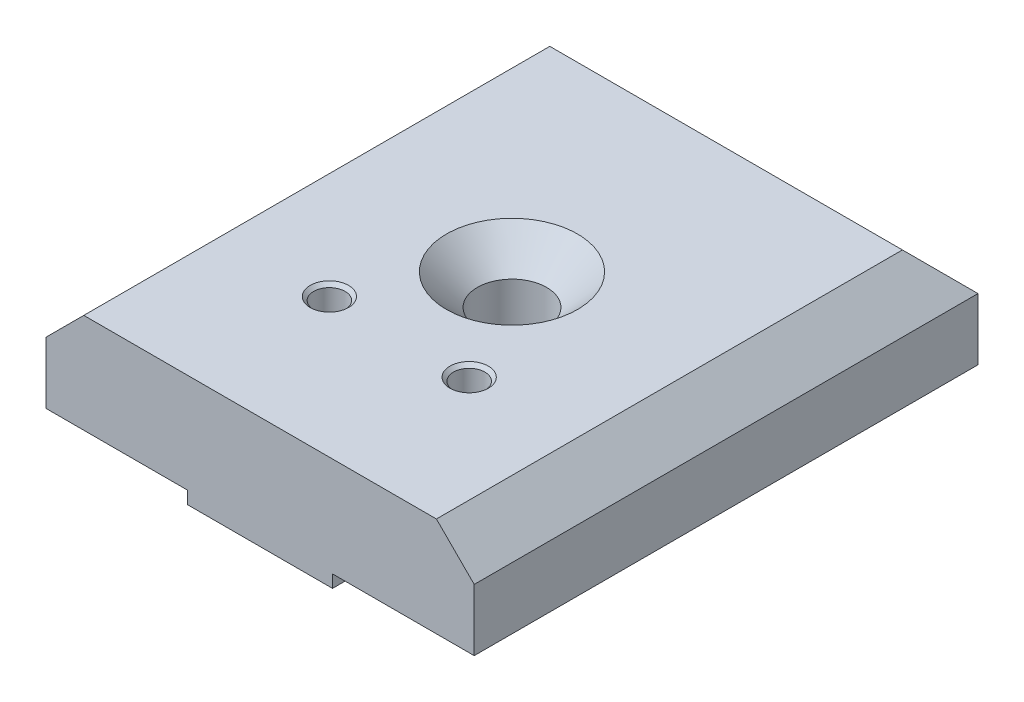
ISO-10303-21;
HEADER;
FILE_DESCRIPTION(('STEP AP214'),'2;1');
FILE_NAME('part.step','',(''),(''),'','','');
FILE_SCHEMA(('AUTOMOTIVE_DESIGN { 1 0 10303 214 1 1 1 1 }'));
ENDSEC;
DATA;
#1=APPLICATION_CONTEXT('core data for automotive mechanical design processes');
#2=APPLICATION_PROTOCOL_DEFINITION('international standard','automotive_design',2000,#1);
#3=PRODUCT_CONTEXT('',#1,'mechanical');
#4=PRODUCT('Part','Part','',(#3));
#5=PRODUCT_RELATED_PRODUCT_CATEGORY('part','',(#4));
#6=PRODUCT_DEFINITION_FORMATION('','',#4);
#7=PRODUCT_DEFINITION_CONTEXT('part definition',#1,'design');
#8=PRODUCT_DEFINITION('design','',#6,#7);
#9=PRODUCT_DEFINITION_SHAPE('','',#8);
#10=(LENGTH_UNIT() NAMED_UNIT(*) SI_UNIT(.MILLI.,.METRE.));
#11=(NAMED_UNIT(*) PLANE_ANGLE_UNIT() SI_UNIT($,.RADIAN.));
#12=(NAMED_UNIT(*) SI_UNIT($,.STERADIAN.) SOLID_ANGLE_UNIT());
#13=UNCERTAINTY_MEASURE_WITH_UNIT(LENGTH_MEASURE(1.E-05),#10,'distance_accuracy_value','');
#14=(GEOMETRIC_REPRESENTATION_CONTEXT(3) GLOBAL_UNCERTAINTY_ASSIGNED_CONTEXT((#13)) GLOBAL_UNIT_ASSIGNED_CONTEXT((#10,
#11,#12)) REPRESENTATION_CONTEXT('',''));
#15=CARTESIAN_POINT('',(0.,0.,0.));
#16=DIRECTION('',(0.,0.,1.));
#17=DIRECTION('',(1.,0.,0.));
#18=AXIS2_PLACEMENT_3D('',#15,#16,#17);
#19=CARTESIAN_POINT('',(0.,0.,0.));
#20=DIRECTION('',(0.,1.,0.));
#21=DIRECTION('',(0.,0.,1.));
#22=AXIS2_PLACEMENT_3D('',#19,#20,#21);
#23=PLANE('',#22);
#24=DIRECTION('',(0.,0.,1.));
#25=VECTOR('',#24,1.);
#26=CARTESIAN_POINT('',(5.75,0.,20.));
#27=LINE('',#26,#25);
#28=CARTESIAN_POINT('',(5.75,0.,-20.));
#29=VERTEX_POINT('',#28);
#30=CARTESIAN_POINT('',(5.75,0.,7.71610373207478));
#31=VERTEX_POINT('',#30);
#32=EDGE_CURVE('E47',#29,#31,#27,.T.);
#33=ORIENTED_EDGE('',*,*,#32,.F.);
#34=DIRECTION('',(-1.,0.,0.));
#35=VECTOR('',#34,1.);
#36=CARTESIAN_POINT('',(-17.,0.,-20.));
#37=LINE('',#36,#35);
#38=CARTESIAN_POINT('',(17.,0.,-20.));
#39=VERTEX_POINT('',#38);
#40=EDGE_CURVE('E196',#39,#29,#37,.T.);
#41=ORIENTED_EDGE('',*,*,#40,.F.);
#42=DIRECTION('',(0.,0.,-1.));
#43=VECTOR('',#42,1.);
#44=CARTESIAN_POINT('',(17.,0.,-20.));
#45=LINE('',#44,#43);
#46=CARTESIAN_POINT('',(17.,0.,20.));
#47=VERTEX_POINT('',#46);
#48=EDGE_CURVE('E187',#47,#39,#45,.T.);
#49=ORIENTED_EDGE('',*,*,#48,.F.);
#50=DIRECTION('',(1.,0.,0.));
#51=VECTOR('',#50,1.);
#52=CARTESIAN_POINT('',(-17.,0.,20.));
#53=LINE('',#52,#51);
#54=CARTESIAN_POINT('',(5.75,0.,20.));
#55=VERTEX_POINT('',#54);
#56=EDGE_CURVE('E61',#55,#47,#53,.T.);
#57=ORIENTED_EDGE('',*,*,#56,.F.);
#58=CARTESIAN_POINT('',(5.75,0.,10.1838962679252));
#59=VERTEX_POINT('',#58);
#60=EDGE_CURVE('E11',#59,#55,#27,.T.);
#61=ORIENTED_EDGE('',*,*,#60,.F.);
#62=CARTESIAN_POINT('',(5.54999999999931,0.,8.94999999999997));
#63=DIRECTION('',(0.,1.,0.));
#64=DIRECTION('',(0.,0.,1.));
#65=AXIS2_PLACEMENT_3D('',#62,#63,#64);
#66=CIRCLE('',#65,1.25);
#67=EDGE_CURVE('E176',#59,#31,#66,.T.);
#68=ORIENTED_EDGE('',*,*,#67,.T.);
#69=EDGE_LOOP('',(#33,#41,#49,#57,#61,#68));
#70=FACE_BOUND('',#69,.T.);
#71=ADVANCED_FACE('F36',(#70),#23,.F.);
#72=DIRECTION('',(0.,0.,-1.));
#73=VECTOR('',#72,1.);
#74=CARTESIAN_POINT('',(-5.75,0.,20.));
#75=LINE('',#74,#73);
#76=CARTESIAN_POINT('',(-5.75,0.,20.));
#77=VERTEX_POINT('',#76);
#78=CARTESIAN_POINT('',(-5.75,0.,10.1838962679252));
#79=VERTEX_POINT('',#78);
#80=EDGE_CURVE('E149',#77,#79,#75,.T.);
#81=ORIENTED_EDGE('',*,*,#80,.F.);
#82=CARTESIAN_POINT('',(-17.,0.,20.));
#83=VERTEX_POINT('',#82);
#84=EDGE_CURVE('E192',#83,#77,#53,.T.);
#85=ORIENTED_EDGE('',*,*,#84,.F.);
#86=DIRECTION('',(0.,0.,1.));
#87=VECTOR('',#86,1.);
#88=CARTESIAN_POINT('',(-17.,0.,-20.));
#89=LINE('',#88,#87);
#90=CARTESIAN_POINT('',(-17.,0.,-20.));
#91=VERTEX_POINT('',#90);
#92=EDGE_CURVE('E198',#91,#83,#89,.T.);
#93=ORIENTED_EDGE('',*,*,#92,.F.);
#94=CARTESIAN_POINT('',(-5.75,0.,-20.));
#95=VERTEX_POINT('',#94);
#96=EDGE_CURVE('E195',#95,#91,#37,.T.);
#97=ORIENTED_EDGE('',*,*,#96,.F.);
#98=CARTESIAN_POINT('',(-5.75,0.,7.71610373207478));
#99=VERTEX_POINT('',#98);
#100=EDGE_CURVE('E45',#99,#95,#75,.T.);
#101=ORIENTED_EDGE('',*,*,#100,.F.);
#102=CARTESIAN_POINT('',(-5.54999999999931,0.,8.94999999999997));
#103=DIRECTION('',(0.,1.,0.));
#104=DIRECTION('',(0.,0.,1.));
#105=AXIS2_PLACEMENT_3D('',#102,#103,#104);
#106=CIRCLE('',#105,1.25);
#107=EDGE_CURVE('E166',#99,#79,#106,.T.);
#108=ORIENTED_EDGE('',*,*,#107,.T.);
#109=EDGE_LOOP('',(#81,#85,#93,#97,#101,#108));
#110=FACE_BOUND('',#109,.T.);
#111=ADVANCED_FACE('F272',(#110),#23,.F.);
#112=CARTESIAN_POINT('',(17.,7.9,-20.));
#113=DIRECTION('',(-1.,0.,0.));
#114=DIRECTION('',(0.,0.,1.));
#115=AXIS2_PLACEMENT_3D('',#112,#113,#114);
#116=PLANE('',#115);
#117=DIRECTION('',(0.,-1.,0.));
#118=VECTOR('',#117,1.);
#119=CARTESIAN_POINT('',(17.,7.9,-20.));
#120=LINE('',#119,#118);
#121=CARTESIAN_POINT('',(17.,4.9,-20.));
#122=VERTEX_POINT('',#121);
#123=EDGE_CURVE('E209',#122,#39,#120,.T.);
#124=ORIENTED_EDGE('',*,*,#123,.F.);
#125=DIRECTION('',(0.,0.,1.));
#126=VECTOR('',#125,1.);
#127=CARTESIAN_POINT('',(17.,4.9,20.));
#128=LINE('',#127,#126);
#129=CARTESIAN_POINT('',(17.,4.9,20.));
#130=VERTEX_POINT('',#129);
#131=EDGE_CURVE('E218',#122,#130,#128,.T.);
#132=ORIENTED_EDGE('',*,*,#131,.T.);
#133=DIRECTION('',(0.,-1.,0.));
#134=VECTOR('',#133,1.);
#135=CARTESIAN_POINT('',(17.,7.9,20.));
#136=LINE('',#135,#134);
#137=EDGE_CURVE('E191',#130,#47,#136,.T.);
#138=ORIENTED_EDGE('',*,*,#137,.T.);
#139=ORIENTED_EDGE('',*,*,#48,.T.);
#140=EDGE_LOOP('',(#124,#132,#138,#139));
#141=FACE_BOUND('',#140,.T.);
#142=ADVANCED_FACE('F249',(#141),#116,.F.);
#143=CARTESIAN_POINT('',(-17.,7.9,-20.));
#144=DIRECTION('',(0.,0.,1.));
#145=DIRECTION('',(1.,0.,0.));
#146=AXIS2_PLACEMENT_3D('',#143,#144,#145);
#147=PLANE('',#146);
#148=DIRECTION('',(0.,-1.,0.));
#149=VECTOR('',#148,1.);
#150=CARTESIAN_POINT('',(-17.,7.9,-20.));
#151=LINE('',#150,#149);
#152=CARTESIAN_POINT('',(-17.,4.9,-20.));
#153=VERTEX_POINT('',#152);
#154=EDGE_CURVE('E206',#153,#91,#151,.T.);
#155=ORIENTED_EDGE('',*,*,#154,.F.);
#156=DIRECTION('',(1.,0.,0.));
#157=VECTOR('',#156,1.);
#158=CARTESIAN_POINT('',(17.,4.9,-20.));
#159=LINE('',#158,#157);
#160=EDGE_CURVE('E224',#153,#122,#159,.T.);
#161=ORIENTED_EDGE('',*,*,#160,.T.);
#162=ORIENTED_EDGE('',*,*,#123,.T.);
#163=ORIENTED_EDGE('',*,*,#40,.T.);
#164=DIRECTION('',(0.,1.,0.));
#165=VECTOR('',#164,1.);
#166=CARTESIAN_POINT('',(5.75,-1.,-20.));
#167=LINE('',#166,#165);
#168=CARTESIAN_POINT('',(5.75,-1.,-20.));
#169=VERTEX_POINT('',#168);
#170=EDGE_CURVE('E243',#169,#29,#167,.T.);
#171=ORIENTED_EDGE('',*,*,#170,.F.);
#172=DIRECTION('',(1.,0.,0.));
#173=VECTOR('',#172,1.);
#174=CARTESIAN_POINT('',(-5.75,-1.,-20.));
#175=LINE('',#174,#173);
#176=CARTESIAN_POINT('',(-5.75,-1.,-20.));
#177=VERTEX_POINT('',#176);
#178=EDGE_CURVE('E145',#177,#169,#175,.T.);
#179=ORIENTED_EDGE('',*,*,#178,.F.);
#180=DIRECTION('',(0.,1.,0.));
#181=VECTOR('',#180,1.);
#182=CARTESIAN_POINT('',(-5.75,-1.,-20.));
#183=LINE('',#182,#181);
#184=EDGE_CURVE('E155',#177,#95,#183,.T.);
#185=ORIENTED_EDGE('',*,*,#184,.T.);
#186=ORIENTED_EDGE('',*,*,#96,.T.);
#187=EDGE_LOOP('',(#155,#161,#162,#163,#171,#179,#185,#186));
#188=FACE_BOUND('',#187,.T.);
#189=ADVANCED_FACE('F246',(#188),#147,.F.);
#190=CARTESIAN_POINT('',(-17.,7.9,-20.));
#191=DIRECTION('',(1.,0.,0.));
#192=DIRECTION('',(0.,0.,-1.));
#193=AXIS2_PLACEMENT_3D('',#190,#191,#192);
#194=PLANE('',#193);
#195=DIRECTION('',(0.,-1.,0.));
#196=VECTOR('',#195,1.);
#197=CARTESIAN_POINT('',(-17.,7.9,20.));
#198=LINE('',#197,#196);
#199=CARTESIAN_POINT('',(-17.,4.9,20.));
#200=VERTEX_POINT('',#199);
#201=EDGE_CURVE('E204',#200,#83,#198,.T.);
#202=ORIENTED_EDGE('',*,*,#201,.F.);
#203=DIRECTION('',(0.,0.,-1.));
#204=VECTOR('',#203,1.);
#205=CARTESIAN_POINT('',(-17.,4.9,-20.));
#206=LINE('',#205,#204);
#207=EDGE_CURVE('E226',#200,#153,#206,.T.);
#208=ORIENTED_EDGE('',*,*,#207,.T.);
#209=ORIENTED_EDGE('',*,*,#154,.T.);
#210=ORIENTED_EDGE('',*,*,#92,.T.);
#211=EDGE_LOOP('',(#202,#208,#209,#210));
#212=FACE_BOUND('',#211,.T.);
#213=ADVANCED_FACE('F269',(#212),#194,.F.);
#214=CARTESIAN_POINT('',(-17.,7.9,20.));
#215=DIRECTION('',(0.,0.,-1.));
#216=DIRECTION('',(-1.,0.,0.));
#217=AXIS2_PLACEMENT_3D('',#214,#215,#216);
#218=PLANE('',#217);
#219=ORIENTED_EDGE('',*,*,#137,.F.);
#220=DIRECTION('',(-0.707106781186547,0.707106781186548,0.));
#221=VECTOR('',#220,1.);
#222=CARTESIAN_POINT('',(14.,7.9,20.));
#223=LINE('',#222,#221);
#224=CARTESIAN_POINT('',(14.,7.9,20.));
#225=VERTEX_POINT('',#224);
#226=EDGE_CURVE('E222',#130,#225,#223,.T.);
#227=ORIENTED_EDGE('',*,*,#226,.T.);
#228=DIRECTION('',(1.,0.,0.));
#229=VECTOR('',#228,1.);
#230=CARTESIAN_POINT('',(-17.,7.9,20.));
#231=LINE('',#230,#229);
#232=CARTESIAN_POINT('',(-14.,7.9,20.));
#233=VERTEX_POINT('',#232);
#234=EDGE_CURVE('E188',#233,#225,#231,.T.);
#235=ORIENTED_EDGE('',*,*,#234,.F.);
#236=DIRECTION('',(-0.707106781186547,-0.707106781186548,0.));
#237=VECTOR('',#236,1.);
#238=CARTESIAN_POINT('',(-14.,7.9,20.));
#239=LINE('',#238,#237);
#240=EDGE_CURVE('E220',#233,#200,#239,.T.);
#241=ORIENTED_EDGE('',*,*,#240,.T.);
#242=ORIENTED_EDGE('',*,*,#201,.T.);
#243=ORIENTED_EDGE('',*,*,#84,.T.);
#244=DIRECTION('',(0.,1.,0.));
#245=VECTOR('',#244,1.);
#246=CARTESIAN_POINT('',(-5.75,-1.,20.));
#247=LINE('',#246,#245);
#248=CARTESIAN_POINT('',(-5.75,-1.,20.));
#249=VERTEX_POINT('',#248);
#250=EDGE_CURVE('E136',#249,#77,#247,.T.);
#251=ORIENTED_EDGE('',*,*,#250,.F.);
#252=DIRECTION('',(-1.,0.,0.));
#253=VECTOR('',#252,1.);
#254=CARTESIAN_POINT('',(-5.75,-1.,20.));
#255=LINE('',#254,#253);
#256=CARTESIAN_POINT('',(5.75,-1.,20.));
#257=VERTEX_POINT('',#256);
#258=EDGE_CURVE('E128',#257,#249,#255,.T.);
#259=ORIENTED_EDGE('',*,*,#258,.F.);
#260=DIRECTION('',(0.,1.,0.));
#261=VECTOR('',#260,1.);
#262=CARTESIAN_POINT('',(5.75,-1.,20.));
#263=LINE('',#262,#261);
#264=EDGE_CURVE('E133',#257,#55,#263,.T.);
#265=ORIENTED_EDGE('',*,*,#264,.T.);
#266=ORIENTED_EDGE('',*,*,#56,.T.);
#267=EDGE_LOOP('',(#219,#227,#235,#241,#242,#243,#251,#259,#265,#266));
#268=FACE_BOUND('',#267,.T.);
#269=ADVANCED_FACE('F131',(#268),#218,.F.);
#270=CARTESIAN_POINT('',(0.,7.9,0.));
#271=DIRECTION('',(0.,1.,0.));
#272=DIRECTION('',(0.,0.,1.));
#273=AXIS2_PLACEMENT_3D('',#270,#271,#272);
#274=PLANE('',#273);
#275=CARTESIAN_POINT('',(-5.54999999999931,7.9,8.94999999999997));
#276=DIRECTION('',(0.,1.,0.));
#277=DIRECTION('',(0.,0.,1.));
#278=AXIS2_PLACEMENT_3D('',#275,#276,#277);
#279=CIRCLE('',#278,1.525);
#280=CARTESIAN_POINT('',(-5.54999999999931,7.9,10.475));
#281=VERTEX_POINT('',#280);
#282=EDGE_CURVE('E159',#281,#281,#279,.T.);
#283=ORIENTED_EDGE('',*,*,#282,.F.);
#284=EDGE_LOOP('',(#283));
#285=FACE_BOUND('',#284,.T.);
#286=CARTESIAN_POINT('',(5.54999999999931,7.9,8.94999999999997));
#287=DIRECTION('',(0.,1.,0.));
#288=DIRECTION('',(0.,0.,1.));
#289=AXIS2_PLACEMENT_3D('',#286,#287,#288);
#290=CIRCLE('',#289,1.525);
#291=CARTESIAN_POINT('',(5.54999999999931,7.9,10.475));
#292=VERTEX_POINT('',#291);
#293=EDGE_CURVE('E169',#292,#292,#290,.T.);
#294=ORIENTED_EDGE('',*,*,#293,.F.);
#295=EDGE_LOOP('',(#294));
#296=FACE_BOUND('',#295,.T.);
#297=CARTESIAN_POINT('',(0.,7.9,0.));
#298=DIRECTION('',(0.,1.,0.));
#299=DIRECTION('',(0.,0.,1.));
#300=AXIS2_PLACEMENT_3D('',#297,#298,#299);
#301=CIRCLE('',#300,5.2);
#302=CARTESIAN_POINT('',(0.,7.9,5.2));
#303=VERTEX_POINT('',#302);
#304=EDGE_CURVE('E178',#303,#303,#301,.T.);
#305=ORIENTED_EDGE('',*,*,#304,.F.);
#306=EDGE_LOOP('',(#305));
#307=FACE_BOUND('',#306,.T.);
#308=ORIENTED_EDGE('',*,*,#234,.T.);
#309=DIRECTION('',(0.,0.,-1.));
#310=VECTOR('',#309,1.);
#311=CARTESIAN_POINT('',(14.,7.9,-20.));
#312=LINE('',#311,#310);
#313=CARTESIAN_POINT('',(14.,7.9,-17.));
#314=VERTEX_POINT('',#313);
#315=EDGE_CURVE('E215',#225,#314,#312,.T.);
#316=ORIENTED_EDGE('',*,*,#315,.T.);
#317=DIRECTION('',(-1.,0.,0.));
#318=VECTOR('',#317,1.);
#319=CARTESIAN_POINT('',(-17.,7.9,-17.));
#320=LINE('',#319,#318);
#321=CARTESIAN_POINT('',(-14.,7.9,-17.));
#322=VERTEX_POINT('',#321);
#323=EDGE_CURVE('E213',#314,#322,#320,.T.);
#324=ORIENTED_EDGE('',*,*,#323,.T.);
#325=DIRECTION('',(0.,0.,1.));
#326=VECTOR('',#325,1.);
#327=CARTESIAN_POINT('',(-14.,7.9,20.));
#328=LINE('',#327,#326);
#329=EDGE_CURVE('E211',#322,#233,#328,.T.);
#330=ORIENTED_EDGE('',*,*,#329,.T.);
#331=EDGE_LOOP('',(#308,#316,#324,#330));
#332=FACE_BOUND('',#331,.T.);
#333=ADVANCED_FACE('F259',(#285,#296,#307,#332),#274,.T.);
#334=CARTESIAN_POINT('',(0.,7.9,0.));
#335=DIRECTION('',(0.,1.,0.));
#336=DIRECTION('',(0.,0.,1.));
#337=AXIS2_PLACEMENT_3D('',#334,#335,#336);
#338=CYLINDRICAL_SURFACE('',#337,2.74999999999999);
#339=CARTESIAN_POINT('',(0.,0.,0.));
#340=DIRECTION('',(0.,1.,0.));
#341=DIRECTION('',(0.,0.,1.));
#342=AXIS2_PLACEMENT_3D('',#339,#340,#341);
#343=CIRCLE('',#342,2.75);
#344=CARTESIAN_POINT('',(0.,0.,2.75));
#345=VERTEX_POINT('',#344);
#346=EDGE_CURVE('E184',#345,#345,#343,.T.);
#347=ORIENTED_EDGE('',*,*,#346,.F.);
#348=EDGE_LOOP('',(#347));
#349=FACE_BOUND('',#348,.T.);
#350=CARTESIAN_POINT('',(0.,5.44999999999999,0.));
#351=DIRECTION('',(0.,1.,0.));
#352=DIRECTION('',(0.,0.,1.));
#353=AXIS2_PLACEMENT_3D('',#350,#351,#352);
#354=CIRCLE('',#353,2.74999999999999);
#355=CARTESIAN_POINT('',(0.,5.44999999999999,2.74999999999999));
#356=VERTEX_POINT('',#355);
#357=EDGE_CURVE('E181',#356,#356,#354,.T.);
#358=ORIENTED_EDGE('',*,*,#357,.T.);
#359=EDGE_LOOP('',(#358));
#360=FACE_BOUND('',#359,.T.);
#361=ADVANCED_FACE('F293',(#349,#360),#338,.F.);
#362=CARTESIAN_POINT('',(0.,7.9,0.));
#363=DIRECTION('',(0.,1.,0.));
#364=DIRECTION('',(0.,0.,1.));
#365=AXIS2_PLACEMENT_3D('',#362,#363,#364);
#366=CONICAL_SURFACE('',#365,5.2,0.785398163397449);
#367=ORIENTED_EDGE('',*,*,#357,.F.);
#368=EDGE_LOOP('',(#367));
#369=FACE_BOUND('',#368,.T.);
#370=ORIENTED_EDGE('',*,*,#304,.T.);
#371=EDGE_LOOP('',(#370));
#372=FACE_BOUND('',#371,.T.);
#373=ADVANCED_FACE('F299',(#369,#372),#366,.F.);
#374=CARTESIAN_POINT('',(5.54999999999931,7.9,8.94999999999997));
#375=DIRECTION('',(0.,1.,0.));
#376=DIRECTION('',(0.,0.,1.));
#377=AXIS2_PLACEMENT_3D('',#374,#375,#376);
#378=CYLINDRICAL_SURFACE('',#377,1.25);
#379=ORIENTED_EDGE('',*,*,#67,.F.);
#380=EDGE_CURVE('E175',#31,#59,#66,.T.);
#381=ORIENTED_EDGE('',*,*,#380,.F.);
#382=EDGE_LOOP('',(#379,#381));
#383=FACE_BOUND('',#382,.T.);
#384=CARTESIAN_POINT('',(5.54999999999931,7.625,8.94999999999997));
#385=DIRECTION('',(0.,1.,0.));
#386=DIRECTION('',(0.,0.,1.));
#387=AXIS2_PLACEMENT_3D('',#384,#385,#386);
#388=CIRCLE('',#387,1.25);
#389=CARTESIAN_POINT('',(5.54999999999931,7.625,10.2));
#390=VERTEX_POINT('',#389);
#391=EDGE_CURVE('E172',#390,#390,#388,.T.);
#392=ORIENTED_EDGE('',*,*,#391,.T.);
#393=EDGE_LOOP('',(#392));
#394=FACE_BOUND('',#393,.T.);
#395=ADVANCED_FACE('F301',(#383,#394),#378,.F.);
#396=CARTESIAN_POINT('',(5.54999999999931,7.9,8.94999999999997));
#397=DIRECTION('',(0.,1.,0.));
#398=DIRECTION('',(0.,0.,1.));
#399=AXIS2_PLACEMENT_3D('',#396,#397,#398);
#400=CONICAL_SURFACE('',#399,1.525,0.785398163397451);
#401=ORIENTED_EDGE('',*,*,#391,.F.);
#402=EDGE_LOOP('',(#401));
#403=FACE_BOUND('',#402,.T.);
#404=ORIENTED_EDGE('',*,*,#293,.T.);
#405=EDGE_LOOP('',(#404));
#406=FACE_BOUND('',#405,.T.);
#407=ADVANCED_FACE('F282',(#403,#406),#400,.F.);
#408=CARTESIAN_POINT('',(-5.54999999999931,7.9,8.94999999999997));
#409=DIRECTION('',(0.,1.,0.));
#410=DIRECTION('',(0.,0.,1.));
#411=AXIS2_PLACEMENT_3D('',#408,#409,#410);
#412=CYLINDRICAL_SURFACE('',#411,1.25);
#413=ORIENTED_EDGE('',*,*,#107,.F.);
#414=EDGE_CURVE('E165',#79,#99,#106,.T.);
#415=ORIENTED_EDGE('',*,*,#414,.F.);
#416=EDGE_LOOP('',(#413,#415));
#417=FACE_BOUND('',#416,.T.);
#418=CARTESIAN_POINT('',(-5.54999999999931,7.625,8.94999999999997));
#419=DIRECTION('',(0.,1.,0.));
#420=DIRECTION('',(0.,0.,1.));
#421=AXIS2_PLACEMENT_3D('',#418,#419,#420);
#422=CIRCLE('',#421,1.25);
#423=CARTESIAN_POINT('',(-5.54999999999931,7.625,10.2));
#424=VERTEX_POINT('',#423);
#425=EDGE_CURVE('E162',#424,#424,#422,.T.);
#426=ORIENTED_EDGE('',*,*,#425,.T.);
#427=EDGE_LOOP('',(#426));
#428=FACE_BOUND('',#427,.T.);
#429=ADVANCED_FACE('F278',(#417,#428),#412,.F.);
#430=CARTESIAN_POINT('',(-5.54999999999931,7.9,8.94999999999997));
#431=DIRECTION('',(0.,1.,0.));
#432=DIRECTION('',(0.,0.,1.));
#433=AXIS2_PLACEMENT_3D('',#430,#431,#432);
#434=CONICAL_SURFACE('',#433,1.525,0.785398163397451);
#435=ORIENTED_EDGE('',*,*,#425,.F.);
#436=EDGE_LOOP('',(#435));
#437=FACE_BOUND('',#436,.T.);
#438=ORIENTED_EDGE('',*,*,#282,.T.);
#439=EDGE_LOOP('',(#438));
#440=FACE_BOUND('',#439,.T.);
#441=ADVANCED_FACE('F281',(#437,#440),#434,.F.);
#442=CARTESIAN_POINT('',(-14.,7.9,0.));
#443=DIRECTION('',(-0.707106781186548,0.707106781186547,0.));
#444=DIRECTION('',(0.,0.,-1.));
#445=AXIS2_PLACEMENT_3D('',#442,#443,#444);
#446=PLANE('',#445);
#447=ORIENTED_EDGE('',*,*,#240,.F.);
#448=ORIENTED_EDGE('',*,*,#329,.F.);
#449=DIRECTION('',(-0.577350269189625,-0.577350269189627,-0.577350269189625));
#450=VECTOR('',#449,1.);
#451=CARTESIAN_POINT('',(-8.33333333333335,13.5666666666667,-11.3333333333333));
#452=LINE('',#451,#450);
#453=EDGE_CURVE('E40',#153,#322,#452,.F.);
#454=ORIENTED_EDGE('',*,*,#453,.F.);
#455=ORIENTED_EDGE('',*,*,#207,.F.);
#456=EDGE_LOOP('',(#447,#448,#454,#455));
#457=FACE_BOUND('',#456,.T.);
#458=ADVANCED_FACE('F38',(#457),#446,.T.);
#459=CARTESIAN_POINT('',(0.,7.9,-17.));
#460=DIRECTION('',(0.,0.707106781186547,-0.707106781186548));
#461=DIRECTION('',(1.,0.,0.));
#462=AXIS2_PLACEMENT_3D('',#459,#460,#461);
#463=PLANE('',#462);
#464=ORIENTED_EDGE('',*,*,#453,.T.);
#465=ORIENTED_EDGE('',*,*,#323,.F.);
#466=DIRECTION('',(0.577350269189625,-0.577350269189627,-0.577350269189625));
#467=VECTOR('',#466,1.);
#468=CARTESIAN_POINT('',(9.33333333333334,12.5666666666667,-12.3333333333334));
#469=LINE('',#468,#467);
#470=EDGE_CURVE('E153',#122,#314,#469,.F.);
#471=ORIENTED_EDGE('',*,*,#470,.F.);
#472=ORIENTED_EDGE('',*,*,#160,.F.);
#473=EDGE_LOOP('',(#464,#465,#471,#472));
#474=FACE_BOUND('',#473,.T.);
#475=ADVANCED_FACE('F267',(#474),#463,.T.);
#476=CARTESIAN_POINT('',(14.,7.9,0.));
#477=DIRECTION('',(0.707106781186548,0.707106781186547,0.));
#478=DIRECTION('',(0.,0.,1.));
#479=AXIS2_PLACEMENT_3D('',#476,#477,#478);
#480=PLANE('',#479);
#481=ORIENTED_EDGE('',*,*,#226,.F.);
#482=ORIENTED_EDGE('',*,*,#131,.F.);
#483=ORIENTED_EDGE('',*,*,#470,.T.);
#484=ORIENTED_EDGE('',*,*,#315,.F.);
#485=EDGE_LOOP('',(#481,#482,#483,#484));
#486=FACE_BOUND('',#485,.T.);
#487=ADVANCED_FACE('F255',(#486),#480,.T.);
#488=CARTESIAN_POINT('',(0.,-1.,0.));
#489=DIRECTION('',(0.,-1.,0.));
#490=DIRECTION('',(0.,0.,-1.));
#491=AXIS2_PLACEMENT_3D('',#488,#489,#490);
#492=PLANE('',#491);
#493=DIRECTION('',(0.,0.,1.));
#494=VECTOR('',#493,1.);
#495=CARTESIAN_POINT('',(5.75,-1.,20.));
#496=LINE('',#495,#494);
#497=EDGE_CURVE('E140',#169,#257,#496,.T.);
#498=ORIENTED_EDGE('',*,*,#497,.T.);
#499=ORIENTED_EDGE('',*,*,#258,.T.);
#500=DIRECTION('',(0.,0.,-1.));
#501=VECTOR('',#500,1.);
#502=CARTESIAN_POINT('',(-5.75,-1.,20.));
#503=LINE('',#502,#501);
#504=EDGE_CURVE('E139',#249,#177,#503,.T.);
#505=ORIENTED_EDGE('',*,*,#504,.T.);
#506=ORIENTED_EDGE('',*,*,#178,.T.);
#507=EDGE_LOOP('',(#498,#499,#505,#506));
#508=FACE_BOUND('',#507,.T.);
#509=ADVANCED_FACE('F143',(#508),#492,.T.);
#510=CARTESIAN_POINT('',(-5.75,-1.,20.));
#511=DIRECTION('',(1.,0.,0.));
#512=DIRECTION('',(0.,0.,-1.));
#513=AXIS2_PLACEMENT_3D('',#510,#511,#512);
#514=PLANE('',#513);
#515=ORIENTED_EDGE('',*,*,#80,.T.);
#516=EDGE_CURVE('E233',#79,#99,#75,.T.);
#517=ORIENTED_EDGE('',*,*,#516,.T.);
#518=ORIENTED_EDGE('',*,*,#100,.T.);
#519=ORIENTED_EDGE('',*,*,#184,.F.);
#520=ORIENTED_EDGE('',*,*,#504,.F.);
#521=ORIENTED_EDGE('',*,*,#250,.T.);
#522=EDGE_LOOP('',(#515,#517,#518,#519,#520,#521));
#523=FACE_BOUND('',#522,.T.);
#524=ADVANCED_FACE('F244',(#523),#514,.F.);
#525=CARTESIAN_POINT('',(5.75,-1.,20.));
#526=DIRECTION('',(-1.,0.,0.));
#527=DIRECTION('',(0.,0.,1.));
#528=AXIS2_PLACEMENT_3D('',#525,#526,#527);
#529=PLANE('',#528);
#530=ORIENTED_EDGE('',*,*,#32,.T.);
#531=EDGE_CURVE('E48',#31,#59,#27,.T.);
#532=ORIENTED_EDGE('',*,*,#531,.T.);
#533=ORIENTED_EDGE('',*,*,#60,.T.);
#534=ORIENTED_EDGE('',*,*,#264,.F.);
#535=ORIENTED_EDGE('',*,*,#497,.F.);
#536=ORIENTED_EDGE('',*,*,#170,.T.);
#537=EDGE_LOOP('',(#530,#532,#533,#534,#535,#536));
#538=FACE_BOUND('',#537,.T.);
#539=ADVANCED_FACE('F151',(#538),#529,.F.);
#540=CARTESIAN_POINT('',(0.,0.,0.));
#541=DIRECTION('',(0.,-1.,0.));
#542=DIRECTION('',(0.,0.,-1.));
#543=AXIS2_PLACEMENT_3D('',#540,#541,#542);
#544=PLANE('',#543);
#545=ORIENTED_EDGE('',*,*,#531,.F.);
#546=ORIENTED_EDGE('',*,*,#380,.T.);
#547=EDGE_LOOP('',(#545,#546));
#548=FACE_BOUND('',#547,.T.);
#549=ADVANCED_FACE('F451',(#548),#544,.F.);
#550=ORIENTED_EDGE('',*,*,#516,.F.);
#551=ORIENTED_EDGE('',*,*,#414,.T.);
#552=EDGE_LOOP('',(#550,#551));
#553=FACE_BOUND('',#552,.T.);
#554=ADVANCED_FACE('F277',(#553),#544,.F.);
#555=ORIENTED_EDGE('',*,*,#346,.T.);
#556=EDGE_LOOP('',(#555));
#557=FACE_BOUND('',#556,.T.);
#558=ADVANCED_FACE('F460',(#557),#544,.F.);
#559=CLOSED_SHELL('',(#71,#111,#142,#189,#213,#269,#333,#361,#373,#395,#407,#429,#441,#458,#475,
#487,#509,#524,#539,#549,#554,#558));
#560=MANIFOLD_SOLID_BREP('B2',#559);
#561=ADVANCED_BREP_SHAPE_REPRESENTATION('',(#18,#560),#14);
#562=SHAPE_DEFINITION_REPRESENTATION(#9,#561);
ENDSEC;
END-ISO-10303-21;
